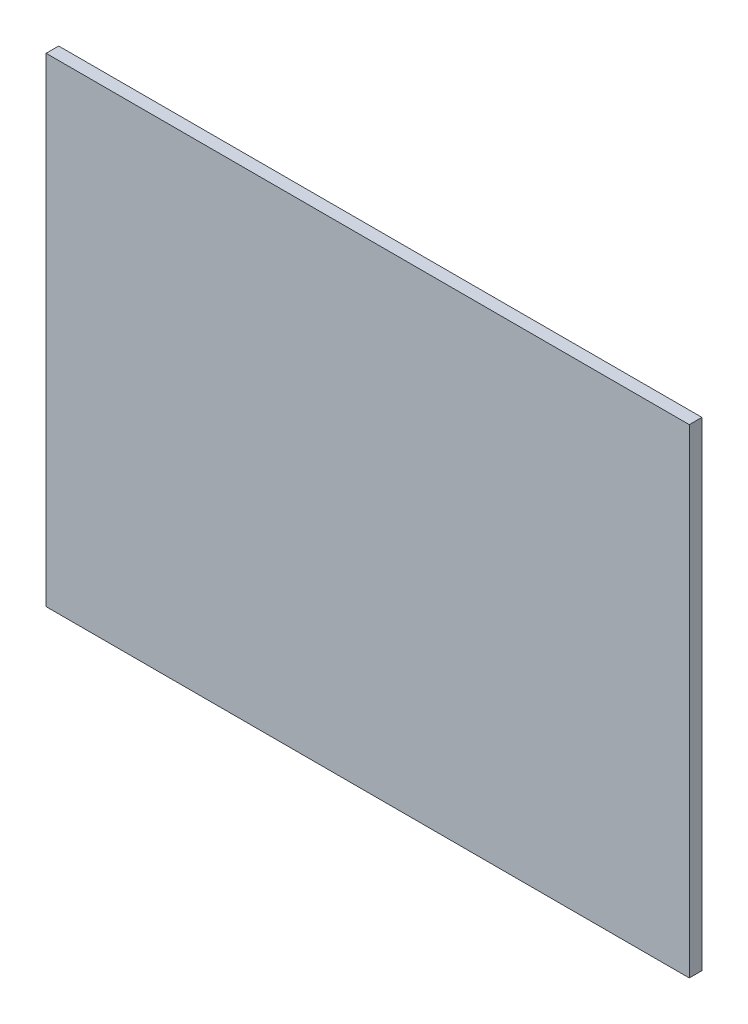
ISO-10303-21;
HEADER;
FILE_DESCRIPTION(('STEP AP214'),'2;1');
FILE_NAME('part.step','',(''),(''),'','','');
FILE_SCHEMA(('AUTOMOTIVE_DESIGN { 1 0 10303 214 1 1 1 1 }'));
ENDSEC;
DATA;
#1=APPLICATION_CONTEXT('core data for automotive mechanical design processes');
#2=APPLICATION_PROTOCOL_DEFINITION('international standard','automotive_design',2000,#1);
#3=PRODUCT_CONTEXT('',#1,'mechanical');
#4=PRODUCT('Part','Part','',(#3));
#5=PRODUCT_RELATED_PRODUCT_CATEGORY('part','',(#4));
#6=PRODUCT_DEFINITION_FORMATION('','',#4);
#7=PRODUCT_DEFINITION_CONTEXT('part definition',#1,'design');
#8=PRODUCT_DEFINITION('design','',#6,#7);
#9=PRODUCT_DEFINITION_SHAPE('','',#8);
#10=(LENGTH_UNIT() NAMED_UNIT(*) SI_UNIT(.MILLI.,.METRE.));
#11=(NAMED_UNIT(*) PLANE_ANGLE_UNIT() SI_UNIT($,.RADIAN.));
#12=(NAMED_UNIT(*) SI_UNIT($,.STERADIAN.) SOLID_ANGLE_UNIT());
#13=UNCERTAINTY_MEASURE_WITH_UNIT(LENGTH_MEASURE(1.E-05),#10,'distance_accuracy_value','');
#14=(GEOMETRIC_REPRESENTATION_CONTEXT(3) GLOBAL_UNCERTAINTY_ASSIGNED_CONTEXT((#13)) GLOBAL_UNIT_ASSIGNED_CONTEXT((#10,
#11,#12)) REPRESENTATION_CONTEXT('',''));
#15=CARTESIAN_POINT('',(0.,0.,0.));
#16=DIRECTION('',(0.,0.,1.));
#17=DIRECTION('',(1.,0.,0.));
#18=AXIS2_PLACEMENT_3D('',#15,#16,#17);
#19=CARTESIAN_POINT('',(0.,0.,10.));
#20=DIRECTION('',(1.,0.,0.));
#21=DIRECTION('',(0.,0.,-1.));
#22=AXIS2_PLACEMENT_3D('',#19,#20,#21);
#23=PLANE('',#22);
#24=DIRECTION('',(0.,-1.,0.));
#25=VECTOR('',#24,1.);
#26=CARTESIAN_POINT('',(0.,0.,0.));
#27=LINE('',#26,#25);
#28=CARTESIAN_POINT('',(0.,380.,0.));
#29=VERTEX_POINT('',#28);
#30=CARTESIAN_POINT('',(0.,0.,0.));
#31=VERTEX_POINT('',#30);
#32=EDGE_CURVE('E95',#29,#31,#27,.T.);
#33=ORIENTED_EDGE('',*,*,#32,.T.);
#34=DIRECTION('',(0.,0.,-1.));
#35=VECTOR('',#34,1.);
#36=CARTESIAN_POINT('',(0.,0.,10.));
#37=LINE('',#36,#35);
#38=CARTESIAN_POINT('',(0.,0.,10.));
#39=VERTEX_POINT('',#38);
#40=EDGE_CURVE('E11',#39,#31,#37,.T.);
#41=ORIENTED_EDGE('',*,*,#40,.F.);
#42=DIRECTION('',(0.,-1.,0.));
#43=VECTOR('',#42,1.);
#44=CARTESIAN_POINT('',(0.,0.,10.));
#45=LINE('',#44,#43);
#46=CARTESIAN_POINT('',(0.,380.,10.));
#47=VERTEX_POINT('',#46);
#48=EDGE_CURVE('E83',#47,#39,#45,.T.);
#49=ORIENTED_EDGE('',*,*,#48,.F.);
#50=DIRECTION('',(0.,0.,-1.));
#51=VECTOR('',#50,1.);
#52=CARTESIAN_POINT('',(0.,380.,10.));
#53=LINE('',#52,#51);
#54=EDGE_CURVE('E91',#47,#29,#53,.T.);
#55=ORIENTED_EDGE('',*,*,#54,.T.);
#56=EDGE_LOOP('',(#33,#41,#49,#55));
#57=FACE_BOUND('',#56,.T.);
#58=ADVANCED_FACE('F32',(#57),#23,.F.);
#59=CARTESIAN_POINT('',(0.,0.,10.));
#60=DIRECTION('',(0.,1.,0.));
#61=DIRECTION('',(0.,0.,1.));
#62=AXIS2_PLACEMENT_3D('',#59,#60,#61);
#63=PLANE('',#62);
#64=DIRECTION('',(1.,0.,0.));
#65=VECTOR('',#64,1.);
#66=CARTESIAN_POINT('',(0.,0.,0.));
#67=LINE('',#66,#65);
#68=CARTESIAN_POINT('',(510.,0.,0.));
#69=VERTEX_POINT('',#68);
#70=EDGE_CURVE('E87',#31,#69,#67,.T.);
#71=ORIENTED_EDGE('',*,*,#70,.T.);
#72=DIRECTION('',(0.,0.,-1.));
#73=VECTOR('',#72,1.);
#74=CARTESIAN_POINT('',(510.,0.,10.));
#75=LINE('',#74,#73);
#76=CARTESIAN_POINT('',(510.,0.,10.));
#77=VERTEX_POINT('',#76);
#78=EDGE_CURVE('E40',#77,#69,#75,.T.);
#79=ORIENTED_EDGE('',*,*,#78,.F.);
#80=DIRECTION('',(1.,0.,0.));
#81=VECTOR('',#80,1.);
#82=CARTESIAN_POINT('',(0.,0.,10.));
#83=LINE('',#82,#81);
#84=EDGE_CURVE('E78',#39,#77,#83,.T.);
#85=ORIENTED_EDGE('',*,*,#84,.F.);
#86=ORIENTED_EDGE('',*,*,#40,.T.);
#87=EDGE_LOOP('',(#71,#79,#85,#86));
#88=FACE_BOUND('',#87,.T.);
#89=ADVANCED_FACE('F86',(#88),#63,.F.);
#90=CARTESIAN_POINT('',(510.,0.,10.));
#91=DIRECTION('',(-1.,0.,0.));
#92=DIRECTION('',(0.,0.,1.));
#93=AXIS2_PLACEMENT_3D('',#90,#91,#92);
#94=PLANE('',#93);
#95=DIRECTION('',(0.,1.,0.));
#96=VECTOR('',#95,1.);
#97=CARTESIAN_POINT('',(510.,0.,0.));
#98=LINE('',#97,#96);
#99=CARTESIAN_POINT('',(510.,380.,0.));
#100=VERTEX_POINT('',#99);
#101=EDGE_CURVE('E65',#69,#100,#98,.T.);
#102=ORIENTED_EDGE('',*,*,#101,.T.);
#103=DIRECTION('',(0.,0.,-1.));
#104=VECTOR('',#103,1.);
#105=CARTESIAN_POINT('',(510.,380.,10.));
#106=LINE('',#105,#104);
#107=CARTESIAN_POINT('',(510.,380.,10.));
#108=VERTEX_POINT('',#107);
#109=EDGE_CURVE('E88',#108,#100,#106,.T.);
#110=ORIENTED_EDGE('',*,*,#109,.F.);
#111=DIRECTION('',(0.,1.,0.));
#112=VECTOR('',#111,1.);
#113=CARTESIAN_POINT('',(510.,0.,10.));
#114=LINE('',#113,#112);
#115=EDGE_CURVE('E81',#77,#108,#114,.T.);
#116=ORIENTED_EDGE('',*,*,#115,.F.);
#117=ORIENTED_EDGE('',*,*,#78,.T.);
#118=EDGE_LOOP('',(#102,#110,#116,#117));
#119=FACE_BOUND('',#118,.T.);
#120=ADVANCED_FACE('F89',(#119),#94,.F.);
#121=CARTESIAN_POINT('',(0.,380.,10.));
#122=DIRECTION('',(0.,-1.,0.));
#123=DIRECTION('',(0.,0.,-1.));
#124=AXIS2_PLACEMENT_3D('',#121,#122,#123);
#125=PLANE('',#124);
#126=DIRECTION('',(-1.,0.,0.));
#127=VECTOR('',#126,1.);
#128=CARTESIAN_POINT('',(0.,380.,0.));
#129=LINE('',#128,#127);
#130=EDGE_CURVE('E71',#100,#29,#129,.T.);
#131=ORIENTED_EDGE('',*,*,#130,.T.);
#132=ORIENTED_EDGE('',*,*,#54,.F.);
#133=DIRECTION('',(-1.,0.,0.));
#134=VECTOR('',#133,1.);
#135=CARTESIAN_POINT('',(0.,380.,10.));
#136=LINE('',#135,#134);
#137=EDGE_CURVE('E48',#108,#47,#136,.T.);
#138=ORIENTED_EDGE('',*,*,#137,.F.);
#139=ORIENTED_EDGE('',*,*,#109,.T.);
#140=EDGE_LOOP('',(#131,#132,#138,#139));
#141=FACE_BOUND('',#140,.T.);
#142=ADVANCED_FACE('F102',(#141),#125,.F.);
#143=CARTESIAN_POINT('',(0.,0.,10.));
#144=DIRECTION('',(0.,0.,-1.));
#145=DIRECTION('',(-1.,0.,0.));
#146=AXIS2_PLACEMENT_3D('',#143,#144,#145);
#147=PLANE('',#146);
#148=ORIENTED_EDGE('',*,*,#48,.T.);
#149=ORIENTED_EDGE('',*,*,#84,.T.);
#150=ORIENTED_EDGE('',*,*,#115,.T.);
#151=ORIENTED_EDGE('',*,*,#137,.T.);
#152=EDGE_LOOP('',(#148,#149,#150,#151));
#153=FACE_BOUND('',#152,.T.);
#154=ADVANCED_FACE('F79',(#153),#147,.F.);
#155=CARTESIAN_POINT('',(0.,0.,0.));
#156=DIRECTION('',(0.,0.,-1.));
#157=DIRECTION('',(-1.,0.,0.));
#158=AXIS2_PLACEMENT_3D('',#155,#156,#157);
#159=PLANE('',#158);
#160=ORIENTED_EDGE('',*,*,#32,.F.);
#161=ORIENTED_EDGE('',*,*,#130,.F.);
#162=ORIENTED_EDGE('',*,*,#101,.F.);
#163=ORIENTED_EDGE('',*,*,#70,.F.);
#164=EDGE_LOOP('',(#160,#161,#162,#163));
#165=FACE_BOUND('',#164,.T.);
#166=ADVANCED_FACE('F105',(#165),#159,.T.);
#167=CLOSED_SHELL('',(#58,#89,#120,#142,#154,#166));
#168=MANIFOLD_SOLID_BREP('B2',#167);
#169=ADVANCED_BREP_SHAPE_REPRESENTATION('',(#18,#168),#14);
#170=SHAPE_DEFINITION_REPRESENTATION(#9,#169);
ENDSEC;
END-ISO-10303-21;
